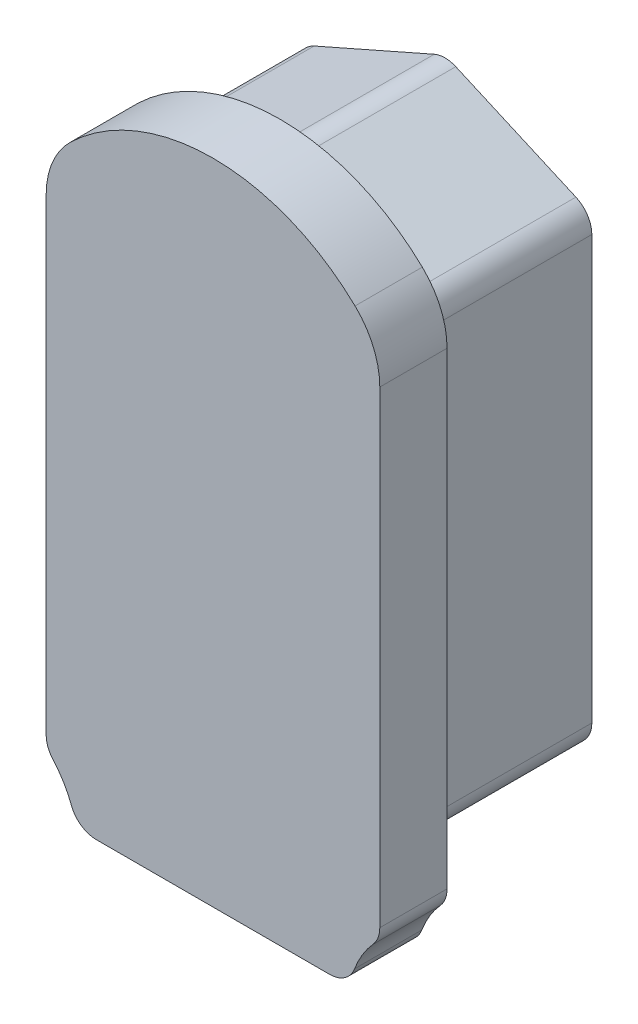
ISO-10303-21;
HEADER;
FILE_DESCRIPTION(('STEP AP214'),'2;1');
FILE_NAME('part.step','',(''),(''),'','','');
FILE_SCHEMA(('AUTOMOTIVE_DESIGN { 1 0 10303 214 1 1 1 1 }'));
ENDSEC;
DATA;
#1=APPLICATION_CONTEXT('core data for automotive mechanical design processes');
#2=APPLICATION_PROTOCOL_DEFINITION('international standard','automotive_design',2000,#1);
#3=PRODUCT_CONTEXT('',#1,'mechanical');
#4=PRODUCT('Part','Part','',(#3));
#5=PRODUCT_RELATED_PRODUCT_CATEGORY('part','',(#4));
#6=PRODUCT_DEFINITION_FORMATION('','',#4);
#7=PRODUCT_DEFINITION_CONTEXT('part definition',#1,'design');
#8=PRODUCT_DEFINITION('design','',#6,#7);
#9=PRODUCT_DEFINITION_SHAPE('','',#8);
#10=(LENGTH_UNIT() NAMED_UNIT(*) SI_UNIT(.MILLI.,.METRE.));
#11=(NAMED_UNIT(*) PLANE_ANGLE_UNIT() SI_UNIT($,.RADIAN.));
#12=(NAMED_UNIT(*) SI_UNIT($,.STERADIAN.) SOLID_ANGLE_UNIT());
#13=UNCERTAINTY_MEASURE_WITH_UNIT(LENGTH_MEASURE(1.E-05),#10,'distance_accuracy_value','');
#14=(GEOMETRIC_REPRESENTATION_CONTEXT(3) GLOBAL_UNCERTAINTY_ASSIGNED_CONTEXT((#13)) GLOBAL_UNIT_ASSIGNED_CONTEXT((#10,
#11,#12)) REPRESENTATION_CONTEXT('',''));
#15=CARTESIAN_POINT('',(0.,0.,0.));
#16=DIRECTION('',(0.,0.,1.));
#17=DIRECTION('',(1.,0.,0.));
#18=AXIS2_PLACEMENT_3D('',#15,#16,#17);
#19=CARTESIAN_POINT('',(-6.25,-12.15,4.52));
#20=DIRECTION('',(1.,0.,0.));
#21=DIRECTION('',(0.,0.,-1.));
#22=AXIS2_PLACEMENT_3D('',#19,#20,#21);
#23=PLANE('',#22);
#24=DIRECTION('',(0.,-1.,0.));
#25=VECTOR('',#24,1.);
#26=CARTESIAN_POINT('',(-6.25,7.84656661439056,2.52));
#27=LINE('',#26,#25);
#28=CARTESIAN_POINT('',(-6.25,7.84656661439056,2.52));
#29=VERTEX_POINT('',#28);
#30=CARTESIAN_POINT('',(-6.25,-9.69593403016156,2.52));
#31=VERTEX_POINT('',#30);
#32=EDGE_CURVE('E387',#29,#31,#27,.T.);
#33=ORIENTED_EDGE('',*,*,#32,.F.);
#34=DIRECTION('',(0.,0.,1.));
#35=VECTOR('',#34,1.);
#36=CARTESIAN_POINT('',(-6.25,7.84656661439056,0.));
#37=LINE('',#36,#35);
#38=CARTESIAN_POINT('',(-6.25,7.84656661439056,0.));
#39=VERTEX_POINT('',#38);
#40=EDGE_CURVE('E234',#29,#39,#37,.F.);
#41=ORIENTED_EDGE('',*,*,#40,.T.);
#42=DIRECTION('',(0.,-1.,0.));
#43=VECTOR('',#42,1.);
#44=CARTESIAN_POINT('',(-6.25,-12.15,0.));
#45=LINE('',#44,#43);
#46=CARTESIAN_POINT('',(-6.25,-9.69593403016156,0.));
#47=VERTEX_POINT('',#46);
#48=EDGE_CURVE('E344',#39,#47,#45,.T.);
#49=ORIENTED_EDGE('',*,*,#48,.T.);
#50=DIRECTION('',(0.,0.,-1.));
#51=VECTOR('',#50,1.);
#52=CARTESIAN_POINT('',(-6.25,-9.69593403016156,4.52));
#53=LINE('',#52,#51);
#54=EDGE_CURVE('E364',#47,#31,#53,.F.);
#55=ORIENTED_EDGE('',*,*,#54,.T.);
#56=EDGE_LOOP('',(#33,#41,#49,#55));
#57=FACE_BOUND('',#56,.T.);
#58=ADVANCED_FACE('F35',(#57),#23,.F.);
#59=CARTESIAN_POINT('',(6.25,-12.15,4.52));
#60=DIRECTION('',(-1.,0.,0.));
#61=DIRECTION('',(0.,0.,1.));
#62=AXIS2_PLACEMENT_3D('',#59,#60,#61);
#63=PLANE('',#62);
#64=DIRECTION('',(0.,1.,0.));
#65=VECTOR('',#64,1.);
#66=CARTESIAN_POINT('',(6.25,-9.69593403016157,2.52));
#67=LINE('',#66,#65);
#68=CARTESIAN_POINT('',(6.25,-9.69593403016157,2.52));
#69=VERTEX_POINT('',#68);
#70=CARTESIAN_POINT('',(6.25,7.84656661439056,2.52));
#71=VERTEX_POINT('',#70);
#72=EDGE_CURVE('E196',#69,#71,#67,.T.);
#73=ORIENTED_EDGE('',*,*,#72,.F.);
#74=DIRECTION('',(0.,0.,-1.));
#75=VECTOR('',#74,1.);
#76=CARTESIAN_POINT('',(6.25,-9.69593403016157,4.52));
#77=LINE('',#76,#75);
#78=CARTESIAN_POINT('',(6.25,-9.69593403016157,0.));
#79=VERTEX_POINT('',#78);
#80=EDGE_CURVE('E209',#69,#79,#77,.T.);
#81=ORIENTED_EDGE('',*,*,#80,.T.);
#82=DIRECTION('',(0.,1.,0.));
#83=VECTOR('',#82,1.);
#84=CARTESIAN_POINT('',(6.25,-12.15,0.));
#85=LINE('',#84,#83);
#86=CARTESIAN_POINT('',(6.25,7.84656661439056,0.));
#87=VERTEX_POINT('',#86);
#88=EDGE_CURVE('E349',#79,#87,#85,.T.);
#89=ORIENTED_EDGE('',*,*,#88,.T.);
#90=DIRECTION('',(0.,0.,1.));
#91=VECTOR('',#90,1.);
#92=CARTESIAN_POINT('',(6.25,7.84656661439056,4.52));
#93=LINE('',#92,#91);
#94=EDGE_CURVE('E212',#87,#71,#93,.T.);
#95=ORIENTED_EDGE('',*,*,#94,.T.);
#96=EDGE_LOOP('',(#73,#81,#89,#95));
#97=FACE_BOUND('',#96,.T.);
#98=ADVANCED_FACE('F207',(#97),#63,.F.);
#99=CARTESIAN_POINT('',(6.25,-12.15,4.52));
#100=DIRECTION('',(0.,1.,0.));
#101=DIRECTION('',(-1.,0.,0.));
#102=AXIS2_PLACEMENT_3D('',#99,#100,#101);
#103=PLANE('',#102);
#104=DIRECTION('',(1.,0.,0.));
#105=VECTOR('',#104,1.);
#106=CARTESIAN_POINT('',(-4.36955631340022,-12.15,2.52));
#107=LINE('',#106,#105);
#108=CARTESIAN_POINT('',(-4.36955631340022,-12.15,2.52));
#109=VERTEX_POINT('',#108);
#110=CARTESIAN_POINT('',(4.36955631340022,-12.15,2.52));
#111=VERTEX_POINT('',#110);
#112=EDGE_CURVE('E395',#109,#111,#107,.T.);
#113=ORIENTED_EDGE('',*,*,#112,.F.);
#114=DIRECTION('',(0.,0.,-1.));
#115=VECTOR('',#114,1.);
#116=CARTESIAN_POINT('',(-4.36955631340022,-12.15,4.52));
#117=LINE('',#116,#115);
#118=CARTESIAN_POINT('',(-4.36955631340022,-12.15,0.));
#119=VERTEX_POINT('',#118);
#120=EDGE_CURVE('E370',#109,#119,#117,.T.);
#121=ORIENTED_EDGE('',*,*,#120,.T.);
#122=DIRECTION('',(1.,0.,0.));
#123=VECTOR('',#122,1.);
#124=CARTESIAN_POINT('',(6.25,-12.15,0.));
#125=LINE('',#124,#123);
#126=CARTESIAN_POINT('',(4.36955631340022,-12.15,0.));
#127=VERTEX_POINT('',#126);
#128=EDGE_CURVE('E346',#119,#127,#125,.T.);
#129=ORIENTED_EDGE('',*,*,#128,.T.);
#130=DIRECTION('',(0.,0.,-1.));
#131=VECTOR('',#130,1.);
#132=CARTESIAN_POINT('',(4.36955631340022,-12.15,4.52));
#133=LINE('',#132,#131);
#134=EDGE_CURVE('E367',#127,#111,#133,.F.);
#135=ORIENTED_EDGE('',*,*,#134,.T.);
#136=EDGE_LOOP('',(#113,#121,#129,#135));
#137=FACE_BOUND('',#136,.T.);
#138=ADVANCED_FACE('F432',(#137),#103,.F.);
#139=CARTESIAN_POINT('',(0.,4.446484375,4.52));
#140=DIRECTION('',(0.,0.,-1.));
#141=DIRECTION('',(-1.,0.,0.));
#142=AXIS2_PLACEMENT_3D('',#139,#140,#141);
#143=CYLINDRICAL_SURFACE('',#142,7.703515625);
#144=DIRECTION('',(0.,0.,-1.));
#145=VECTOR('',#144,1.);
#146=CARTESIAN_POINT('',(-5.32291753176646,10.0152097169999,4.52));
#147=LINE('',#146,#145);
#148=CARTESIAN_POINT('',(-5.32291753176647,10.0152097169999,0.));
#149=VERTEX_POINT('',#148);
#150=CARTESIAN_POINT('',(-5.32291753176646,10.0152097169999,2.52));
#151=VERTEX_POINT('',#150);
#152=EDGE_CURVE('E218',#149,#151,#147,.F.);
#153=ORIENTED_EDGE('',*,*,#152,.T.);
#154=CARTESIAN_POINT('',(0.,4.446484375,2.52));
#155=DIRECTION('',(0.,0.,1.));
#156=DIRECTION('',(1.,0.,0.));
#157=AXIS2_PLACEMENT_3D('',#154,#155,#156);
#158=CIRCLE('',#157,7.703515625);
#159=CARTESIAN_POINT('',(5.32291753176646,10.0152097169999,2.52));
#160=VERTEX_POINT('',#159);
#161=EDGE_CURVE('E50',#160,#151,#158,.T.);
#162=ORIENTED_EDGE('',*,*,#161,.F.);
#163=DIRECTION('',(0.,0.,-1.));
#164=VECTOR('',#163,1.);
#165=CARTESIAN_POINT('',(5.32291753176646,10.0152097169999,4.52));
#166=LINE('',#165,#164);
#167=CARTESIAN_POINT('',(5.32291753176646,10.0152097169999,0.));
#168=VERTEX_POINT('',#167);
#169=EDGE_CURVE('E222',#160,#168,#166,.T.);
#170=ORIENTED_EDGE('',*,*,#169,.T.);
#171=CARTESIAN_POINT('',(0.,4.446484375,0.));
#172=DIRECTION('',(0.,0.,-1.));
#173=DIRECTION('',(-1.,0.,0.));
#174=AXIS2_PLACEMENT_3D('',#171,#172,#173);
#175=CIRCLE('',#174,7.703515625);
#176=EDGE_CURVE('E341',#149,#168,#175,.T.);
#177=ORIENTED_EDGE('',*,*,#176,.F.);
#178=EDGE_LOOP('',(#153,#162,#170,#177));
#179=FACE_BOUND('',#178,.T.);
#180=ADVANCED_FACE('F504',(#179),#143,.T.);
#181=CARTESIAN_POINT('',(8.66766862128923,-12.7589375787261,4.52));
#182=DIRECTION('',(0.,0.,-1.));
#183=DIRECTION('',(-1.,0.,0.));
#184=AXIS2_PLACEMENT_3D('',#181,#182,#183);
#185=CYLINDRICAL_SURFACE('',#184,3.58938444058285);
#186=CARTESIAN_POINT('',(8.66766862128923,-12.7589375787261,2.52));
#187=DIRECTION('',(0.,0.,-1.));
#188=DIRECTION('',(1.,0.,0.));
#189=AXIS2_PLACEMENT_3D('',#186,#187,#188);
#190=CIRCLE('',#189,3.58938444058285);
#191=CARTESIAN_POINT('',(5.30608982100569,-11.5005780785106,2.52));
#192=VERTEX_POINT('',#191);
#193=CARTESIAN_POINT('',(5.99468998305472,-10.3633445703375,2.52));
#194=VERTEX_POINT('',#193);
#195=EDGE_CURVE('E199',#192,#194,#190,.T.);
#196=ORIENTED_EDGE('',*,*,#195,.F.);
#197=DIRECTION('',(0.,0.,-1.));
#198=VECTOR('',#197,1.);
#199=CARTESIAN_POINT('',(5.30608982100569,-11.5005780785106,4.52));
#200=LINE('',#199,#198);
#201=CARTESIAN_POINT('',(5.30608982100569,-11.5005780785106,0.));
#202=VERTEX_POINT('',#201);
#203=EDGE_CURVE('E219',#192,#202,#200,.T.);
#204=ORIENTED_EDGE('',*,*,#203,.T.);
#205=CARTESIAN_POINT('',(8.66766862128923,-12.7589375787261,0.));
#206=DIRECTION('',(0.,0.,-1.));
#207=DIRECTION('',(-1.,0.,0.));
#208=AXIS2_PLACEMENT_3D('',#205,#206,#207);
#209=CIRCLE('',#208,3.58938444058285);
#210=CARTESIAN_POINT('',(5.99468998305472,-10.3633445703375,0.));
#211=VERTEX_POINT('',#210);
#212=EDGE_CURVE('E338',#202,#211,#209,.T.);
#213=ORIENTED_EDGE('',*,*,#212,.T.);
#214=DIRECTION('',(0.,0.,-1.));
#215=VECTOR('',#214,1.);
#216=CARTESIAN_POINT('',(5.99468998305472,-10.3633445703375,4.52));
#217=LINE('',#216,#215);
#218=EDGE_CURVE('E224',#211,#194,#217,.F.);
#219=ORIENTED_EDGE('',*,*,#218,.T.);
#220=EDGE_LOOP('',(#196,#204,#213,#219));
#221=FACE_BOUND('',#220,.T.);
#222=ADVANCED_FACE('F372',(#221),#185,.F.);
#223=CARTESIAN_POINT('',(-8.66766862128923,-12.7589375787261,4.52));
#224=DIRECTION('',(0.,0.,-1.));
#225=DIRECTION('',(-1.,0.,0.));
#226=AXIS2_PLACEMENT_3D('',#223,#224,#225);
#227=CYLINDRICAL_SURFACE('',#226,3.58938444058285);
#228=CARTESIAN_POINT('',(-8.66766862128923,-12.7589375787261,2.52));
#229=DIRECTION('',(0.,0.,-1.));
#230=DIRECTION('',(1.,0.,0.));
#231=AXIS2_PLACEMENT_3D('',#228,#229,#230);
#232=CIRCLE('',#231,3.58938444058285);
#233=CARTESIAN_POINT('',(-5.99468998305472,-10.3633445703375,2.52));
#234=VERTEX_POINT('',#233);
#235=CARTESIAN_POINT('',(-5.30608982100568,-11.5005780785106,2.52));
#236=VERTEX_POINT('',#235);
#237=EDGE_CURVE('E391',#234,#236,#232,.T.);
#238=ORIENTED_EDGE('',*,*,#237,.F.);
#239=DIRECTION('',(0.,0.,-1.));
#240=VECTOR('',#239,1.);
#241=CARTESIAN_POINT('',(-5.99468998305472,-10.3633445703375,4.52));
#242=LINE('',#241,#240);
#243=CARTESIAN_POINT('',(-5.99468998305472,-10.3633445703375,0.));
#244=VERTEX_POINT('',#243);
#245=EDGE_CURVE('E354',#234,#244,#242,.T.);
#246=ORIENTED_EDGE('',*,*,#245,.T.);
#247=CARTESIAN_POINT('',(-8.66766862128923,-12.7589375787261,0.));
#248=DIRECTION('',(0.,0.,-1.));
#249=DIRECTION('',(1.,0.,0.));
#250=AXIS2_PLACEMENT_3D('',#247,#248,#249);
#251=CIRCLE('',#250,3.58938444058285);
#252=CARTESIAN_POINT('',(-5.30608982100568,-11.5005780785106,0.));
#253=VERTEX_POINT('',#252);
#254=EDGE_CURVE('E318',#244,#253,#251,.T.);
#255=ORIENTED_EDGE('',*,*,#254,.T.);
#256=DIRECTION('',(0.,0.,-1.));
#257=VECTOR('',#256,1.);
#258=CARTESIAN_POINT('',(-5.30608982100568,-11.5005780785106,4.52));
#259=LINE('',#258,#257);
#260=EDGE_CURVE('E351',#253,#236,#259,.F.);
#261=ORIENTED_EDGE('',*,*,#260,.T.);
#262=EDGE_LOOP('',(#238,#246,#255,#261));
#263=FACE_BOUND('',#262,.T.);
#264=ADVANCED_FACE('F441',(#263),#227,.F.);
#265=CARTESIAN_POINT('',(-5.25,-9.69593403016156,4.52));
#266=DIRECTION('',(0.,0.,-1.));
#267=DIRECTION('',(-1.,0.,0.));
#268=AXIS2_PLACEMENT_3D('',#265,#266,#267);
#269=CYLINDRICAL_SURFACE('',#268,1.);
#270=ORIENTED_EDGE('',*,*,#245,.F.);
#271=CARTESIAN_POINT('',(-5.25,-9.69593403016156,2.52));
#272=DIRECTION('',(0.,0.,1.));
#273=DIRECTION('',(1.,0.,0.));
#274=AXIS2_PLACEMENT_3D('',#271,#272,#273);
#275=CIRCLE('',#274,1.);
#276=EDGE_CURVE('E389',#31,#234,#275,.T.);
#277=ORIENTED_EDGE('',*,*,#276,.F.);
#278=ORIENTED_EDGE('',*,*,#54,.F.);
#279=CARTESIAN_POINT('',(-5.25,-9.69593403016156,0.));
#280=DIRECTION('',(0.,0.,1.));
#281=DIRECTION('',(1.,0.,0.));
#282=AXIS2_PLACEMENT_3D('',#279,#280,#281);
#283=CIRCLE('',#282,1.);
#284=EDGE_CURVE('E361',#244,#47,#283,.F.);
#285=ORIENTED_EDGE('',*,*,#284,.F.);
#286=EDGE_LOOP('',(#270,#277,#278,#285));
#287=FACE_BOUND('',#286,.T.);
#288=ADVANCED_FACE('F437',(#287),#269,.T.);
#289=CARTESIAN_POINT('',(-4.36955631340022,-11.15,4.52));
#290=DIRECTION('',(0.,0.,-1.));
#291=DIRECTION('',(-1.,0.,0.));
#292=AXIS2_PLACEMENT_3D('',#289,#290,#291);
#293=CYLINDRICAL_SURFACE('',#292,1.);
#294=ORIENTED_EDGE('',*,*,#120,.F.);
#295=CARTESIAN_POINT('',(-4.36955631340022,-11.15,2.52));
#296=DIRECTION('',(0.,0.,1.));
#297=DIRECTION('',(1.,0.,0.));
#298=AXIS2_PLACEMENT_3D('',#295,#296,#297);
#299=CIRCLE('',#298,1.);
#300=EDGE_CURVE('E393',#236,#109,#299,.T.);
#301=ORIENTED_EDGE('',*,*,#300,.F.);
#302=ORIENTED_EDGE('',*,*,#260,.F.);
#303=CARTESIAN_POINT('',(-4.36955631340022,-11.15,0.));
#304=DIRECTION('',(0.,0.,1.));
#305=DIRECTION('',(1.,0.,0.));
#306=AXIS2_PLACEMENT_3D('',#303,#304,#305);
#307=CIRCLE('',#306,1.);
#308=EDGE_CURVE('E359',#119,#253,#307,.F.);
#309=ORIENTED_EDGE('',*,*,#308,.F.);
#310=EDGE_LOOP('',(#294,#301,#302,#309));
#311=FACE_BOUND('',#310,.T.);
#312=ADVANCED_FACE('F440',(#311),#293,.T.);
#313=CARTESIAN_POINT('',(4.36955631340022,-11.15,4.52));
#314=DIRECTION('',(0.,0.,-1.));
#315=DIRECTION('',(-1.,0.,0.));
#316=AXIS2_PLACEMENT_3D('',#313,#314,#315);
#317=CYLINDRICAL_SURFACE('',#316,1.);
#318=ORIENTED_EDGE('',*,*,#203,.F.);
#319=CARTESIAN_POINT('',(4.36955631340022,-11.15,2.52));
#320=DIRECTION('',(0.,0.,1.));
#321=DIRECTION('',(1.,0.,0.));
#322=AXIS2_PLACEMENT_3D('',#319,#320,#321);
#323=CIRCLE('',#322,1.);
#324=EDGE_CURVE('E397',#111,#192,#323,.T.);
#325=ORIENTED_EDGE('',*,*,#324,.F.);
#326=ORIENTED_EDGE('',*,*,#134,.F.);
#327=CARTESIAN_POINT('',(4.36955631340022,-11.15,0.));
#328=DIRECTION('',(0.,0.,1.));
#329=DIRECTION('',(1.,0.,0.));
#330=AXIS2_PLACEMENT_3D('',#327,#328,#329);
#331=CIRCLE('',#330,1.);
#332=EDGE_CURVE('E357',#202,#127,#331,.F.);
#333=ORIENTED_EDGE('',*,*,#332,.F.);
#334=EDGE_LOOP('',(#318,#325,#326,#333));
#335=FACE_BOUND('',#334,.T.);
#336=ADVANCED_FACE('F445',(#335),#317,.T.);
#337=CARTESIAN_POINT('',(5.25,-9.69593403016157,4.52));
#338=DIRECTION('',(0.,0.,-1.));
#339=DIRECTION('',(-1.,0.,0.));
#340=AXIS2_PLACEMENT_3D('',#337,#338,#339);
#341=CYLINDRICAL_SURFACE('',#340,1.);
#342=ORIENTED_EDGE('',*,*,#80,.F.);
#343=CARTESIAN_POINT('',(5.25,-9.69593403016157,2.52));
#344=DIRECTION('',(0.,0.,1.));
#345=DIRECTION('',(1.,0.,0.));
#346=AXIS2_PLACEMENT_3D('',#343,#344,#345);
#347=CIRCLE('',#346,1.);
#348=EDGE_CURVE('E193',#194,#69,#347,.T.);
#349=ORIENTED_EDGE('',*,*,#348,.F.);
#350=ORIENTED_EDGE('',*,*,#218,.F.);
#351=CARTESIAN_POINT('',(5.25,-9.69593403016157,0.));
#352=DIRECTION('',(0.,0.,1.));
#353=DIRECTION('',(1.,0.,0.));
#354=AXIS2_PLACEMENT_3D('',#351,#352,#353);
#355=CIRCLE('',#354,1.);
#356=EDGE_CURVE('E216',#79,#211,#355,.F.);
#357=ORIENTED_EDGE('',*,*,#356,.F.);
#358=EDGE_LOOP('',(#342,#349,#350,#357));
#359=FACE_BOUND('',#358,.T.);
#360=ADVANCED_FACE('F215',(#359),#341,.T.);
#361=CARTESIAN_POINT('',(3.25,7.84656661439056,4.52));
#362=DIRECTION('',(0.,0.,-1.));
#363=DIRECTION('',(-1.,0.,0.));
#364=AXIS2_PLACEMENT_3D('',#361,#362,#363);
#365=CYLINDRICAL_SURFACE('',#364,3.);
#366=ORIENTED_EDGE('',*,*,#169,.F.);
#367=CARTESIAN_POINT('',(3.25,7.84656661439056,2.52));
#368=DIRECTION('',(0.,0.,1.));
#369=DIRECTION('',(1.,0.,0.));
#370=AXIS2_PLACEMENT_3D('',#367,#368,#369);
#371=CIRCLE('',#370,3.);
#372=EDGE_CURVE('E213',#71,#160,#371,.T.);
#373=ORIENTED_EDGE('',*,*,#372,.F.);
#374=ORIENTED_EDGE('',*,*,#94,.F.);
#375=CARTESIAN_POINT('',(3.25,7.84656661439056,0.));
#376=DIRECTION('',(0.,0.,1.));
#377=DIRECTION('',(1.,0.,0.));
#378=AXIS2_PLACEMENT_3D('',#375,#376,#377);
#379=CIRCLE('',#378,3.);
#380=EDGE_CURVE('E231',#168,#87,#379,.F.);
#381=ORIENTED_EDGE('',*,*,#380,.F.);
#382=EDGE_LOOP('',(#366,#373,#374,#381));
#383=FACE_BOUND('',#382,.T.);
#384=ADVANCED_FACE('F381',(#383),#365,.T.);
#385=CARTESIAN_POINT('',(-3.25,7.84656661439056,4.52));
#386=DIRECTION('',(0.,0.,-1.));
#387=DIRECTION('',(-1.,0.,0.));
#388=AXIS2_PLACEMENT_3D('',#385,#386,#387);
#389=CYLINDRICAL_SURFACE('',#388,3.);
#390=ORIENTED_EDGE('',*,*,#40,.F.);
#391=CARTESIAN_POINT('',(-3.25,7.84656661439056,2.52));
#392=DIRECTION('',(0.,0.,1.));
#393=DIRECTION('',(1.,0.,0.));
#394=AXIS2_PLACEMENT_3D('',#391,#392,#393);
#395=CIRCLE('',#394,3.);
#396=EDGE_CURVE('E383',#151,#29,#395,.T.);
#397=ORIENTED_EDGE('',*,*,#396,.F.);
#398=ORIENTED_EDGE('',*,*,#152,.F.);
#399=CARTESIAN_POINT('',(-3.25,7.84656661439056,0.));
#400=DIRECTION('',(0.,0.,1.));
#401=DIRECTION('',(1.,0.,0.));
#402=AXIS2_PLACEMENT_3D('',#399,#400,#401);
#403=CIRCLE('',#402,3.);
#404=EDGE_CURVE('E229',#39,#149,#403,.F.);
#405=ORIENTED_EDGE('',*,*,#404,.F.);
#406=EDGE_LOOP('',(#390,#397,#398,#405));
#407=FACE_BOUND('',#406,.T.);
#408=ADVANCED_FACE('F454',(#407),#389,.T.);
#409=CARTESIAN_POINT('',(0.,0.,0.));
#410=DIRECTION('',(0.,0.,1.));
#411=DIRECTION('',(1.,0.,0.));
#412=AXIS2_PLACEMENT_3D('',#409,#410,#411);
#413=PLANE('',#412);
#414=ORIENTED_EDGE('',*,*,#176,.T.);
#415=ORIENTED_EDGE('',*,*,#380,.T.);
#416=ORIENTED_EDGE('',*,*,#88,.F.);
#417=ORIENTED_EDGE('',*,*,#356,.T.);
#418=ORIENTED_EDGE('',*,*,#212,.F.);
#419=ORIENTED_EDGE('',*,*,#332,.T.);
#420=ORIENTED_EDGE('',*,*,#128,.F.);
#421=ORIENTED_EDGE('',*,*,#308,.T.);
#422=ORIENTED_EDGE('',*,*,#254,.F.);
#423=ORIENTED_EDGE('',*,*,#284,.T.);
#424=ORIENTED_EDGE('',*,*,#48,.F.);
#425=ORIENTED_EDGE('',*,*,#404,.T.);
#426=EDGE_LOOP('',(#414,#415,#416,#417,#418,#419,#420,#421,#422,#423,#424,#425));
#427=FACE_BOUND('',#426,.T.);
#428=DIRECTION('',(0.915120010721414,0.403181554609383,0.));
#429=VECTOR('',#428,1.);
#430=CARTESIAN_POINT('',(-5.5,8.72682213876681,0.));
#431=LINE('',#430,#429);
#432=CARTESIAN_POINT('',(-4.90318155460938,8.98976709222975,0.));
#433=VERTEX_POINT('',#432);
#434=CARTESIAN_POINT('',(-0.403181554609383,10.9723671605114,0.));
#435=VERTEX_POINT('',#434);
#436=EDGE_CURVE('E324',#433,#435,#431,.T.);
#437=ORIENTED_EDGE('',*,*,#436,.F.);
#438=CARTESIAN_POINT('',(-4.5,8.07464708150833,0.));
#439=DIRECTION('',(0.,0.,1.));
#440=DIRECTION('',(1.,0.,0.));
#441=AXIS2_PLACEMENT_3D('',#438,#439,#440);
#442=CIRCLE('',#441,1.);
#443=CARTESIAN_POINT('',(-5.5,8.07464708150833,0.));
#444=VERTEX_POINT('',#443);
#445=EDGE_CURVE('E280',#433,#444,#442,.T.);
#446=ORIENTED_EDGE('',*,*,#445,.T.);
#447=DIRECTION('',(0.,1.,0.));
#448=VECTOR('',#447,1.);
#449=CARTESIAN_POINT('',(-5.5,-8.42682213876683,0.));
#450=LINE('',#449,#448);
#451=CARTESIAN_POINT('',(-5.5,-7.77464708150835,0.));
#452=VERTEX_POINT('',#451);
#453=EDGE_CURVE('E332',#452,#444,#450,.T.);
#454=ORIENTED_EDGE('',*,*,#453,.F.);
#455=CARTESIAN_POINT('',(-4.5,-7.77464708150835,0.));
#456=DIRECTION('',(0.,0.,1.));
#457=DIRECTION('',(1.,0.,0.));
#458=AXIS2_PLACEMENT_3D('',#455,#456,#457);
#459=CIRCLE('',#458,1.);
#460=CARTESIAN_POINT('',(-4.90318155460938,-8.68976709222977,0.));
#461=VERTEX_POINT('',#460);
#462=EDGE_CURVE('E282',#452,#461,#459,.T.);
#463=ORIENTED_EDGE('',*,*,#462,.T.);
#464=DIRECTION('',(-0.915120010721415,0.403181554609381,0.));
#465=VECTOR('',#464,1.);
#466=CARTESIAN_POINT('',(0.,-10.85,0.));
#467=LINE('',#466,#465);
#468=CARTESIAN_POINT('',(-0.403181554609381,-10.6723671605115,0.));
#469=VERTEX_POINT('',#468);
#470=EDGE_CURVE('E291',#469,#461,#467,.T.);
#471=ORIENTED_EDGE('',*,*,#470,.F.);
#472=CARTESIAN_POINT('',(0.,-9.75724714979004,0.));
#473=DIRECTION('',(0.,0.,1.));
#474=DIRECTION('',(1.,0.,0.));
#475=AXIS2_PLACEMENT_3D('',#472,#473,#474);
#476=CIRCLE('',#475,1.);
#477=CARTESIAN_POINT('',(0.403181554609381,-10.6723671605115,0.));
#478=VERTEX_POINT('',#477);
#479=EDGE_CURVE('E284',#469,#478,#476,.T.);
#480=ORIENTED_EDGE('',*,*,#479,.T.);
#481=DIRECTION('',(-0.915120010721415,-0.403181554609381,0.));
#482=VECTOR('',#481,1.);
#483=CARTESIAN_POINT('',(5.5,-8.42682213876683,0.));
#484=LINE('',#483,#482);
#485=CARTESIAN_POINT('',(4.90318155460938,-8.68976709222977,0.));
#486=VERTEX_POINT('',#485);
#487=EDGE_CURVE('E289',#486,#478,#484,.T.);
#488=ORIENTED_EDGE('',*,*,#487,.F.);
#489=CARTESIAN_POINT('',(4.5,-7.77464708150835,0.));
#490=DIRECTION('',(0.,0.,1.));
#491=DIRECTION('',(1.,0.,0.));
#492=AXIS2_PLACEMENT_3D('',#489,#490,#491);
#493=CIRCLE('',#492,1.);
#494=CARTESIAN_POINT('',(5.5,-7.77464708150835,0.));
#495=VERTEX_POINT('',#494);
#496=EDGE_CURVE('E43',#486,#495,#493,.T.);
#497=ORIENTED_EDGE('',*,*,#496,.T.);
#498=DIRECTION('',(0.,-1.,0.));
#499=VECTOR('',#498,1.);
#500=CARTESIAN_POINT('',(5.5,8.72682213876683,0.));
#501=LINE('',#500,#499);
#502=CARTESIAN_POINT('',(5.5,8.07464708150835,0.));
#503=VERTEX_POINT('',#502);
#504=EDGE_CURVE('E300',#503,#495,#501,.T.);
#505=ORIENTED_EDGE('',*,*,#504,.F.);
#506=CARTESIAN_POINT('',(4.5,8.07464708150835,0.));
#507=DIRECTION('',(0.,0.,1.));
#508=DIRECTION('',(1.,0.,0.));
#509=AXIS2_PLACEMENT_3D('',#506,#507,#508);
#510=CIRCLE('',#509,1.);
#511=CARTESIAN_POINT('',(4.90318155460938,8.98976709222976,0.));
#512=VERTEX_POINT('',#511);
#513=EDGE_CURVE('E11',#503,#512,#510,.T.);
#514=ORIENTED_EDGE('',*,*,#513,.T.);
#515=DIRECTION('',(0.915120010721415,-0.403181554609381,0.));
#516=VECTOR('',#515,1.);
#517=CARTESIAN_POINT('',(0.,11.15,0.));
#518=LINE('',#517,#516);
#519=CARTESIAN_POINT('',(0.403181554609379,10.9723671605114,0.));
#520=VERTEX_POINT('',#519);
#521=EDGE_CURVE('E327',#520,#512,#518,.T.);
#522=ORIENTED_EDGE('',*,*,#521,.F.);
#523=CARTESIAN_POINT('',(0.,10.05724714979,0.));
#524=DIRECTION('',(0.,0.,1.));
#525=DIRECTION('',(1.,0.,0.));
#526=AXIS2_PLACEMENT_3D('',#523,#524,#525);
#527=CIRCLE('',#526,1.);
#528=EDGE_CURVE('E278',#520,#435,#527,.T.);
#529=ORIENTED_EDGE('',*,*,#528,.T.);
#530=EDGE_LOOP('',(#437,#446,#454,#463,#471,#480,#488,#497,#505,#514,#522,#529));
#531=FACE_BOUND('',#530,.T.);
#532=ADVANCED_FACE('F288',(#427,#531),#413,.F.);
#533=CARTESIAN_POINT('',(-5.5,8.72682213876681,-6.174));
#534=DIRECTION('',(0.403181554609383,-0.915120010721414,0.));
#535=DIRECTION('',(0.915120010721414,0.403181554609383,0.));
#536=AXIS2_PLACEMENT_3D('',#533,#534,#535);
#537=PLANE('',#536);
#538=ORIENTED_EDGE('',*,*,#436,.T.);
#539=DIRECTION('',(0.,0.,1.));
#540=VECTOR('',#539,1.);
#541=CARTESIAN_POINT('',(-0.403181554609385,10.9723671605114,-6.174));
#542=LINE('',#541,#540);
#543=CARTESIAN_POINT('',(-0.403181554609383,10.9723671605114,-6.174));
#544=VERTEX_POINT('',#543);
#545=EDGE_CURVE('E244',#435,#544,#542,.F.);
#546=ORIENTED_EDGE('',*,*,#545,.T.);
#547=DIRECTION('',(0.915120010721414,0.403181554609383,0.));
#548=VECTOR('',#547,1.);
#549=CARTESIAN_POINT('',(-5.5,8.72682213876681,-6.174));
#550=LINE('',#549,#548);
#551=CARTESIAN_POINT('',(-4.90318155460938,8.98976709222975,-6.174));
#552=VERTEX_POINT('',#551);
#553=EDGE_CURVE('E335',#552,#544,#550,.T.);
#554=ORIENTED_EDGE('',*,*,#553,.F.);
#555=DIRECTION('',(0.,0.,1.));
#556=VECTOR('',#555,1.);
#557=CARTESIAN_POINT('',(-4.90318155460938,8.98976709222975,-6.174));
#558=LINE('',#557,#556);
#559=EDGE_CURVE('E241',#552,#433,#558,.T.);
#560=ORIENTED_EDGE('',*,*,#559,.T.);
#561=EDGE_LOOP('',(#538,#546,#554,#560));
#562=FACE_BOUND('',#561,.T.);
#563=ADVANCED_FACE('F579',(#562),#537,.F.);
#564=CARTESIAN_POINT('',(0.,11.15,-6.174));
#565=DIRECTION('',(-0.403181554609381,-0.915120010721415,0.));
#566=DIRECTION('',(0.915120010721415,-0.403181554609381,0.));
#567=AXIS2_PLACEMENT_3D('',#564,#565,#566);
#568=PLANE('',#567);
#569=DIRECTION('',(0.915120010721415,-0.403181554609381,0.));
#570=VECTOR('',#569,1.);
#571=CARTESIAN_POINT('',(0.,11.15,-6.174));
#572=LINE('',#571,#570);
#573=CARTESIAN_POINT('',(0.403181554609379,10.9723671605114,-6.174));
#574=VERTEX_POINT('',#573);
#575=CARTESIAN_POINT('',(4.90318155460938,8.98976709222976,-6.174));
#576=VERTEX_POINT('',#575);
#577=EDGE_CURVE('E401',#574,#576,#572,.T.);
#578=ORIENTED_EDGE('',*,*,#577,.F.);
#579=DIRECTION('',(0.,0.,1.));
#580=VECTOR('',#579,1.);
#581=CARTESIAN_POINT('',(0.403181554609379,10.9723671605114,-6.174));
#582=LINE('',#581,#580);
#583=EDGE_CURVE('E238',#574,#520,#582,.T.);
#584=ORIENTED_EDGE('',*,*,#583,.T.);
#585=ORIENTED_EDGE('',*,*,#521,.T.);
#586=DIRECTION('',(0.,0.,1.));
#587=VECTOR('',#586,1.);
#588=CARTESIAN_POINT('',(4.90318155460938,8.98976709222976,-6.174));
#589=LINE('',#588,#587);
#590=EDGE_CURVE('E236',#512,#576,#589,.F.);
#591=ORIENTED_EDGE('',*,*,#590,.T.);
#592=EDGE_LOOP('',(#578,#584,#585,#591));
#593=FACE_BOUND('',#592,.T.);
#594=ADVANCED_FACE('F418',(#593),#568,.F.);
#595=CARTESIAN_POINT('',(5.5,8.72682213876683,-6.174));
#596=DIRECTION('',(-1.,0.,0.));
#597=DIRECTION('',(0.,-1.,0.));
#598=AXIS2_PLACEMENT_3D('',#595,#596,#597);
#599=PLANE('',#598);
#600=ORIENTED_EDGE('',*,*,#504,.T.);
#601=DIRECTION('',(0.,0.,1.));
#602=VECTOR('',#601,1.);
#603=CARTESIAN_POINT('',(5.5,-7.77464708150835,-6.174));
#604=LINE('',#603,#602);
#605=CARTESIAN_POINT('',(5.5,-7.77464708150835,-6.174));
#606=VERTEX_POINT('',#605);
#607=EDGE_CURVE('E276',#495,#606,#604,.F.);
#608=ORIENTED_EDGE('',*,*,#607,.T.);
#609=DIRECTION('',(0.,-1.,0.));
#610=VECTOR('',#609,1.);
#611=CARTESIAN_POINT('',(5.5,8.72682213876683,-6.174));
#612=LINE('',#611,#610);
#613=CARTESIAN_POINT('',(5.5,8.07464708150835,-6.174));
#614=VERTEX_POINT('',#613);
#615=EDGE_CURVE('E320',#614,#606,#612,.T.);
#616=ORIENTED_EDGE('',*,*,#615,.F.);
#617=DIRECTION('',(0.,0.,1.));
#618=VECTOR('',#617,1.);
#619=CARTESIAN_POINT('',(5.5,8.07464708150835,-6.174));
#620=LINE('',#619,#618);
#621=EDGE_CURVE('E273',#614,#503,#620,.T.);
#622=ORIENTED_EDGE('',*,*,#621,.T.);
#623=EDGE_LOOP('',(#600,#608,#616,#622));
#624=FACE_BOUND('',#623,.T.);
#625=ADVANCED_FACE('F412',(#624),#599,.F.);
#626=CARTESIAN_POINT('',(5.5,-8.42682213876683,-6.174));
#627=DIRECTION('',(-0.403181554609381,0.915120010721415,0.));
#628=DIRECTION('',(-0.915120010721415,-0.403181554609381,0.));
#629=AXIS2_PLACEMENT_3D('',#626,#627,#628);
#630=PLANE('',#629);
#631=ORIENTED_EDGE('',*,*,#487,.T.);
#632=DIRECTION('',(0.,0.,1.));
#633=VECTOR('',#632,1.);
#634=CARTESIAN_POINT('',(0.403181554609382,-10.6723671605115,-6.174));
#635=LINE('',#634,#633);
#636=CARTESIAN_POINT('',(0.403181554609381,-10.6723671605115,-6.174));
#637=VERTEX_POINT('',#636);
#638=EDGE_CURVE('E271',#478,#637,#635,.F.);
#639=ORIENTED_EDGE('',*,*,#638,.T.);
#640=DIRECTION('',(-0.915120010721415,-0.403181554609381,0.));
#641=VECTOR('',#640,1.);
#642=CARTESIAN_POINT('',(5.5,-8.42682213876683,-6.174));
#643=LINE('',#642,#641);
#644=CARTESIAN_POINT('',(4.90318155460938,-8.68976709222977,-6.174));
#645=VERTEX_POINT('',#644);
#646=EDGE_CURVE('E311',#645,#637,#643,.T.);
#647=ORIENTED_EDGE('',*,*,#646,.F.);
#648=DIRECTION('',(0.,0.,1.));
#649=VECTOR('',#648,1.);
#650=CARTESIAN_POINT('',(4.90318155460938,-8.68976709222977,-6.174));
#651=LINE('',#650,#649);
#652=EDGE_CURVE('E268',#645,#486,#651,.T.);
#653=ORIENTED_EDGE('',*,*,#652,.T.);
#654=EDGE_LOOP('',(#631,#639,#647,#653));
#655=FACE_BOUND('',#654,.T.);
#656=ADVANCED_FACE('F296',(#655),#630,.F.);
#657=CARTESIAN_POINT('',(0.,-10.85,-6.174));
#658=DIRECTION('',(0.403181554609381,0.915120010721415,0.));
#659=DIRECTION('',(-0.915120010721415,0.403181554609381,0.));
#660=AXIS2_PLACEMENT_3D('',#657,#658,#659);
#661=PLANE('',#660);
#662=ORIENTED_EDGE('',*,*,#470,.T.);
#663=DIRECTION('',(0.,0.,1.));
#664=VECTOR('',#663,1.);
#665=CARTESIAN_POINT('',(-4.90318155460938,-8.68976709222977,-6.174));
#666=LINE('',#665,#664);
#667=CARTESIAN_POINT('',(-4.90318155460938,-8.68976709222977,-6.174));
#668=VERTEX_POINT('',#667);
#669=EDGE_CURVE('E266',#461,#668,#666,.F.);
#670=ORIENTED_EDGE('',*,*,#669,.T.);
#671=DIRECTION('',(-0.915120010721415,0.403181554609381,0.));
#672=VECTOR('',#671,1.);
#673=CARTESIAN_POINT('',(0.,-10.85,-6.174));
#674=LINE('',#673,#672);
#675=CARTESIAN_POINT('',(-0.403181554609381,-10.6723671605115,-6.174));
#676=VERTEX_POINT('',#675);
#677=EDGE_CURVE('E309',#676,#668,#674,.T.);
#678=ORIENTED_EDGE('',*,*,#677,.F.);
#679=DIRECTION('',(0.,0.,1.));
#680=VECTOR('',#679,1.);
#681=CARTESIAN_POINT('',(-0.403181554609381,-10.6723671605115,-6.174));
#682=LINE('',#681,#680);
#683=EDGE_CURVE('E263',#676,#469,#682,.T.);
#684=ORIENTED_EDGE('',*,*,#683,.T.);
#685=EDGE_LOOP('',(#662,#670,#678,#684));
#686=FACE_BOUND('',#685,.T.);
#687=ADVANCED_FACE('F313',(#686),#661,.F.);
#688=CARTESIAN_POINT('',(-5.5,-8.42682213876683,-6.174));
#689=DIRECTION('',(1.,0.,0.));
#690=DIRECTION('',(0.,1.,0.));
#691=AXIS2_PLACEMENT_3D('',#688,#689,#690);
#692=PLANE('',#691);
#693=ORIENTED_EDGE('',*,*,#453,.T.);
#694=DIRECTION('',(0.,0.,1.));
#695=VECTOR('',#694,1.);
#696=CARTESIAN_POINT('',(-5.5,8.07464708150833,-6.174));
#697=LINE('',#696,#695);
#698=CARTESIAN_POINT('',(-5.5,8.07464708150833,-6.174));
#699=VERTEX_POINT('',#698);
#700=EDGE_CURVE('E261',#444,#699,#697,.F.);
#701=ORIENTED_EDGE('',*,*,#700,.T.);
#702=DIRECTION('',(0.,1.,0.));
#703=VECTOR('',#702,1.);
#704=CARTESIAN_POINT('',(-5.5,-8.42682213876683,-6.174));
#705=LINE('',#704,#703);
#706=CARTESIAN_POINT('',(-5.5,-7.77464708150835,-6.174));
#707=VERTEX_POINT('',#706);
#708=EDGE_CURVE('E315',#707,#699,#705,.T.);
#709=ORIENTED_EDGE('',*,*,#708,.F.);
#710=DIRECTION('',(0.,0.,1.));
#711=VECTOR('',#710,1.);
#712=CARTESIAN_POINT('',(-5.5,-7.77464708150835,-6.174));
#713=LINE('',#712,#711);
#714=EDGE_CURVE('E258',#707,#452,#713,.T.);
#715=ORIENTED_EDGE('',*,*,#714,.T.);
#716=EDGE_LOOP('',(#693,#701,#709,#715));
#717=FACE_BOUND('',#716,.T.);
#718=ADVANCED_FACE('F611',(#717),#692,.F.);
#719=CARTESIAN_POINT('',(0.,0.,-6.174));
#720=DIRECTION('',(0.,0.,-1.));
#721=DIRECTION('',(-1.,0.,0.));
#722=AXIS2_PLACEMENT_3D('',#719,#720,#721);
#723=PLANE('',#722);
#724=ORIENTED_EDGE('',*,*,#553,.T.);
#725=CARTESIAN_POINT('',(0.,10.05724714979,-6.174));
#726=DIRECTION('',(0.,0.,-1.));
#727=DIRECTION('',(-1.,0.,0.));
#728=AXIS2_PLACEMENT_3D('',#725,#726,#727);
#729=CIRCLE('',#728,1.);
#730=EDGE_CURVE('E256',#544,#574,#729,.T.);
#731=ORIENTED_EDGE('',*,*,#730,.T.);
#732=ORIENTED_EDGE('',*,*,#577,.T.);
#733=CARTESIAN_POINT('',(4.5,8.07464708150835,-6.174));
#734=DIRECTION('',(0.,0.,-1.));
#735=DIRECTION('',(-1.,0.,0.));
#736=AXIS2_PLACEMENT_3D('',#733,#734,#735);
#737=CIRCLE('',#736,1.);
#738=EDGE_CURVE('E246',#576,#614,#737,.T.);
#739=ORIENTED_EDGE('',*,*,#738,.T.);
#740=ORIENTED_EDGE('',*,*,#615,.T.);
#741=CARTESIAN_POINT('',(4.5,-7.77464708150835,-6.174));
#742=DIRECTION('',(0.,0.,-1.));
#743=DIRECTION('',(-1.,0.,0.));
#744=AXIS2_PLACEMENT_3D('',#741,#742,#743);
#745=CIRCLE('',#744,1.);
#746=EDGE_CURVE('E248',#606,#645,#745,.T.);
#747=ORIENTED_EDGE('',*,*,#746,.T.);
#748=ORIENTED_EDGE('',*,*,#646,.T.);
#749=CARTESIAN_POINT('',(0.,-9.75724714979004,-6.174));
#750=DIRECTION('',(0.,0.,-1.));
#751=DIRECTION('',(-1.,0.,0.));
#752=AXIS2_PLACEMENT_3D('',#749,#750,#751);
#753=CIRCLE('',#752,1.);
#754=EDGE_CURVE('E250',#637,#676,#753,.T.);
#755=ORIENTED_EDGE('',*,*,#754,.T.);
#756=ORIENTED_EDGE('',*,*,#677,.T.);
#757=CARTESIAN_POINT('',(-4.5,-7.77464708150835,-6.174));
#758=DIRECTION('',(0.,0.,-1.));
#759=DIRECTION('',(-1.,0.,0.));
#760=AXIS2_PLACEMENT_3D('',#757,#758,#759);
#761=CIRCLE('',#760,1.);
#762=EDGE_CURVE('E252',#668,#707,#761,.T.);
#763=ORIENTED_EDGE('',*,*,#762,.T.);
#764=ORIENTED_EDGE('',*,*,#708,.T.);
#765=CARTESIAN_POINT('',(-4.5,8.07464708150833,-6.174));
#766=DIRECTION('',(0.,0.,-1.));
#767=DIRECTION('',(-1.,0.,0.));
#768=AXIS2_PLACEMENT_3D('',#765,#766,#767);
#769=CIRCLE('',#768,1.);
#770=EDGE_CURVE('E254',#699,#552,#769,.T.);
#771=ORIENTED_EDGE('',*,*,#770,.T.);
#772=EDGE_LOOP('',(#724,#731,#732,#739,#740,#747,#748,#755,#756,#763,#764,#771));
#773=FACE_BOUND('',#772,.T.);
#774=ADVANCED_FACE('F308',(#773),#723,.T.);
#775=CARTESIAN_POINT('',(0.,10.05724714979,-6.174));
#776=DIRECTION('',(0.,0.,1.));
#777=DIRECTION('',(1.,0.,0.));
#778=AXIS2_PLACEMENT_3D('',#775,#776,#777);
#779=CYLINDRICAL_SURFACE('',#778,1.);
#780=ORIENTED_EDGE('',*,*,#730,.F.);
#781=ORIENTED_EDGE('',*,*,#545,.F.);
#782=ORIENTED_EDGE('',*,*,#528,.F.);
#783=ORIENTED_EDGE('',*,*,#583,.F.);
#784=EDGE_LOOP('',(#780,#781,#782,#783));
#785=FACE_BOUND('',#784,.T.);
#786=ADVANCED_FACE('F458',(#785),#779,.T.);
#787=CARTESIAN_POINT('',(-4.5,8.07464708150833,-6.174));
#788=DIRECTION('',(0.,0.,1.));
#789=DIRECTION('',(1.,0.,0.));
#790=AXIS2_PLACEMENT_3D('',#787,#788,#789);
#791=CYLINDRICAL_SURFACE('',#790,1.);
#792=ORIENTED_EDGE('',*,*,#770,.F.);
#793=ORIENTED_EDGE('',*,*,#700,.F.);
#794=ORIENTED_EDGE('',*,*,#445,.F.);
#795=ORIENTED_EDGE('',*,*,#559,.F.);
#796=EDGE_LOOP('',(#792,#793,#794,#795));
#797=FACE_BOUND('',#796,.T.);
#798=ADVANCED_FACE('F461',(#797),#791,.T.);
#799=CARTESIAN_POINT('',(-4.5,-7.77464708150835,-6.174));
#800=DIRECTION('',(0.,0.,1.));
#801=DIRECTION('',(1.,0.,0.));
#802=AXIS2_PLACEMENT_3D('',#799,#800,#801);
#803=CYLINDRICAL_SURFACE('',#802,1.);
#804=ORIENTED_EDGE('',*,*,#762,.F.);
#805=ORIENTED_EDGE('',*,*,#669,.F.);
#806=ORIENTED_EDGE('',*,*,#462,.F.);
#807=ORIENTED_EDGE('',*,*,#714,.F.);
#808=EDGE_LOOP('',(#804,#805,#806,#807));
#809=FACE_BOUND('',#808,.T.);
#810=ADVANCED_FACE('F465',(#809),#803,.T.);
#811=CARTESIAN_POINT('',(0.,-9.75724714979004,-6.174));
#812=DIRECTION('',(0.,0.,1.));
#813=DIRECTION('',(1.,0.,0.));
#814=AXIS2_PLACEMENT_3D('',#811,#812,#813);
#815=CYLINDRICAL_SURFACE('',#814,1.);
#816=ORIENTED_EDGE('',*,*,#754,.F.);
#817=ORIENTED_EDGE('',*,*,#638,.F.);
#818=ORIENTED_EDGE('',*,*,#479,.F.);
#819=ORIENTED_EDGE('',*,*,#683,.F.);
#820=EDGE_LOOP('',(#816,#817,#818,#819));
#821=FACE_BOUND('',#820,.T.);
#822=ADVANCED_FACE('F303',(#821),#815,.T.);
#823=CARTESIAN_POINT('',(4.5,-7.77464708150835,-6.174));
#824=DIRECTION('',(0.,0.,1.));
#825=DIRECTION('',(1.,0.,0.));
#826=AXIS2_PLACEMENT_3D('',#823,#824,#825);
#827=CYLINDRICAL_SURFACE('',#826,1.);
#828=ORIENTED_EDGE('',*,*,#746,.F.);
#829=ORIENTED_EDGE('',*,*,#607,.F.);
#830=ORIENTED_EDGE('',*,*,#496,.F.);
#831=ORIENTED_EDGE('',*,*,#652,.F.);
#832=EDGE_LOOP('',(#828,#829,#830,#831));
#833=FACE_BOUND('',#832,.T.);
#834=ADVANCED_FACE('F411',(#833),#827,.T.);
#835=CARTESIAN_POINT('',(4.5,8.07464708150835,-6.174));
#836=DIRECTION('',(0.,0.,1.));
#837=DIRECTION('',(1.,0.,0.));
#838=AXIS2_PLACEMENT_3D('',#835,#836,#837);
#839=CYLINDRICAL_SURFACE('',#838,1.);
#840=ORIENTED_EDGE('',*,*,#738,.F.);
#841=ORIENTED_EDGE('',*,*,#590,.F.);
#842=ORIENTED_EDGE('',*,*,#513,.F.);
#843=ORIENTED_EDGE('',*,*,#621,.F.);
#844=EDGE_LOOP('',(#840,#841,#842,#843));
#845=FACE_BOUND('',#844,.T.);
#846=ADVANCED_FACE('F37',(#845),#839,.T.);
#847=CARTESIAN_POINT('',(5.25,-9.69593403016157,2.52));
#848=DIRECTION('',(0.,0.,1.));
#849=DIRECTION('',(1.,0.,0.));
#850=AXIS2_PLACEMENT_3D('',#847,#848,#849);
#851=PLANE('',#850);
#852=ORIENTED_EDGE('',*,*,#348,.T.);
#853=ORIENTED_EDGE('',*,*,#72,.T.);
#854=ORIENTED_EDGE('',*,*,#372,.T.);
#855=ORIENTED_EDGE('',*,*,#161,.T.);
#856=ORIENTED_EDGE('',*,*,#396,.T.);
#857=ORIENTED_EDGE('',*,*,#32,.T.);
#858=ORIENTED_EDGE('',*,*,#276,.T.);
#859=ORIENTED_EDGE('',*,*,#237,.T.);
#860=ORIENTED_EDGE('',*,*,#300,.T.);
#861=ORIENTED_EDGE('',*,*,#112,.T.);
#862=ORIENTED_EDGE('',*,*,#324,.T.);
#863=ORIENTED_EDGE('',*,*,#195,.T.);
#864=EDGE_LOOP('',(#852,#853,#854,#855,#856,#857,#858,#859,#860,#861,#862,#863));
#865=FACE_BOUND('',#864,.T.);
#866=ADVANCED_FACE('F195',(#865),#851,.T.);
#867=CLOSED_SHELL('',(#58,#98,#138,#180,#222,#264,#288,#312,#336,#360,#384,#408,#532,#563,#594,
#625,#656,#687,#718,#774,#786,#798,#810,#822,#834,#846,#866));
#868=MANIFOLD_SOLID_BREP('B2',#867);
#869=ADVANCED_BREP_SHAPE_REPRESENTATION('',(#18,#868),#14);
#870=SHAPE_DEFINITION_REPRESENTATION(#9,#869);
ENDSEC;
END-ISO-10303-21;
